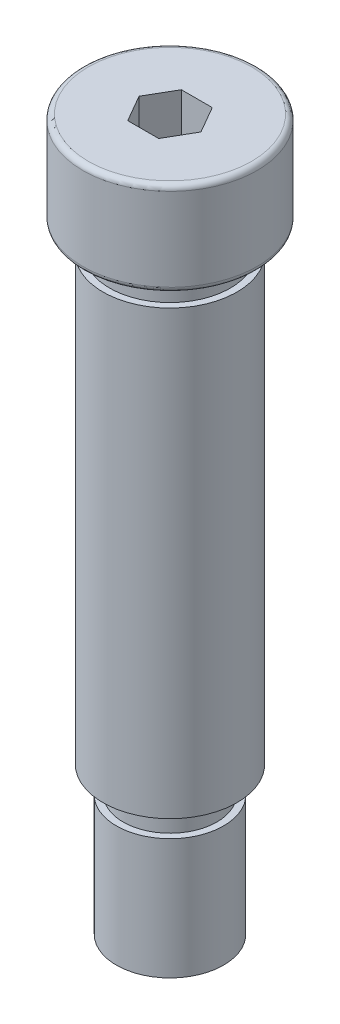
ISO-10303-21;
HEADER;
FILE_DESCRIPTION(('STEP AP214'),'2;1');
FILE_NAME('part.step','',(''),(''),'','','');
FILE_SCHEMA(('AUTOMOTIVE_DESIGN { 1 0 10303 214 1 1 1 1 }'));
ENDSEC;
DATA;
#1=APPLICATION_CONTEXT('core data for automotive mechanical design processes');
#2=APPLICATION_PROTOCOL_DEFINITION('international standard','automotive_design',2000,#1);
#3=PRODUCT_CONTEXT('',#1,'mechanical');
#4=PRODUCT('Part','Part','',(#3));
#5=PRODUCT_RELATED_PRODUCT_CATEGORY('part','',(#4));
#6=PRODUCT_DEFINITION_FORMATION('','',#4);
#7=PRODUCT_DEFINITION_CONTEXT('part definition',#1,'design');
#8=PRODUCT_DEFINITION('design','',#6,#7);
#9=PRODUCT_DEFINITION_SHAPE('','',#8);
#10=(LENGTH_UNIT() NAMED_UNIT(*) SI_UNIT(.MILLI.,.METRE.));
#11=(NAMED_UNIT(*) PLANE_ANGLE_UNIT() SI_UNIT($,.RADIAN.));
#12=(NAMED_UNIT(*) SI_UNIT($,.STERADIAN.) SOLID_ANGLE_UNIT());
#13=UNCERTAINTY_MEASURE_WITH_UNIT(LENGTH_MEASURE(1.E-05),#10,'distance_accuracy_value','');
#14=(GEOMETRIC_REPRESENTATION_CONTEXT(3) GLOBAL_UNCERTAINTY_ASSIGNED_CONTEXT((#13)) GLOBAL_UNIT_ASSIGNED_CONTEXT((#10,
#11,#12)) REPRESENTATION_CONTEXT('',''));
#15=CARTESIAN_POINT('',(0.,0.,0.));
#16=DIRECTION('',(0.,0.,1.));
#17=DIRECTION('',(1.,0.,0.));
#18=AXIS2_PLACEMENT_3D('',#15,#16,#17);
#19=CARTESIAN_POINT('',(0.,53.,0.));
#20=DIRECTION('',(0.,-1.,0.));
#21=DIRECTION('',(0.,0.,-1.));
#22=AXIS2_PLACEMENT_3D('',#19,#20,#21);
#23=PLANE('',#22);
#24=DIRECTION('',(-1.,0.,0.));
#25=VECTOR('',#24,1.);
#26=CARTESIAN_POINT('',(1.15470053837925,53.,-2.));
#27=LINE('',#26,#25);
#28=CARTESIAN_POINT('',(1.15470053837925,53.,-2.));
#29=VERTEX_POINT('',#28);
#30=CARTESIAN_POINT('',(-1.15470053837925,53.,-2.));
#31=VERTEX_POINT('',#30);
#32=EDGE_CURVE('E126',#29,#31,#27,.T.);
#33=ORIENTED_EDGE('',*,*,#32,.F.);
#34=DIRECTION('',(-0.5,0.,-0.866025403784439));
#35=VECTOR('',#34,1.);
#36=CARTESIAN_POINT('',(2.3094010767585,53.,0.));
#37=LINE('',#36,#35);
#38=CARTESIAN_POINT('',(2.3094010767585,53.,0.));
#39=VERTEX_POINT('',#38);
#40=EDGE_CURVE('E52',#39,#29,#37,.T.);
#41=ORIENTED_EDGE('',*,*,#40,.F.);
#42=DIRECTION('',(0.5,0.,-0.866025403784439));
#43=VECTOR('',#42,1.);
#44=CARTESIAN_POINT('',(1.15470053837925,53.,2.));
#45=LINE('',#44,#43);
#46=CARTESIAN_POINT('',(1.15470053837925,53.,2.));
#47=VERTEX_POINT('',#46);
#48=EDGE_CURVE('E135',#47,#39,#45,.T.);
#49=ORIENTED_EDGE('',*,*,#48,.F.);
#50=DIRECTION('',(1.,0.,0.));
#51=VECTOR('',#50,1.);
#52=CARTESIAN_POINT('',(-1.15470053837925,53.,2.));
#53=LINE('',#52,#51);
#54=CARTESIAN_POINT('',(-1.15470053837925,53.,2.));
#55=VERTEX_POINT('',#54);
#56=EDGE_CURVE('E133',#55,#47,#53,.T.);
#57=ORIENTED_EDGE('',*,*,#56,.F.);
#58=DIRECTION('',(0.5,0.,0.866025403784439));
#59=VECTOR('',#58,1.);
#60=CARTESIAN_POINT('',(-2.3094010767585,53.,0.));
#61=LINE('',#60,#59);
#62=CARTESIAN_POINT('',(-2.3094010767585,53.,0.));
#63=VERTEX_POINT('',#62);
#64=EDGE_CURVE('E100',#63,#55,#61,.T.);
#65=ORIENTED_EDGE('',*,*,#64,.F.);
#66=DIRECTION('',(-0.5,0.,0.866025403784439));
#67=VECTOR('',#66,1.);
#68=CARTESIAN_POINT('',(-1.15470053837925,53.,-2.));
#69=LINE('',#68,#67);
#70=EDGE_CURVE('E129',#31,#63,#69,.T.);
#71=ORIENTED_EDGE('',*,*,#70,.F.);
#72=EDGE_LOOP('',(#33,#41,#49,#57,#65,#71));
#73=FACE_BOUND('',#72,.T.);
#74=CARTESIAN_POINT('',(0.,53.,0.));
#75=DIRECTION('',(0.,-1.,0.));
#76=DIRECTION('',(0.,0.,-1.));
#77=AXIS2_PLACEMENT_3D('',#74,#75,#76);
#78=CIRCLE('',#77,6.1);
#79=CARTESIAN_POINT('',(0.,53.,-6.1));
#80=VERTEX_POINT('',#79);
#81=EDGE_CURVE('E11',#80,#80,#78,.T.);
#82=ORIENTED_EDGE('',*,*,#81,.F.);
#83=EDGE_LOOP('',(#82));
#84=FACE_BOUND('',#83,.T.);
#85=ADVANCED_FACE('F38',(#73,#84),#23,.F.);
#86=CARTESIAN_POINT('',(0.,52.6,0.));
#87=DIRECTION('',(0.,-1.,0.));
#88=DIRECTION('',(0.,0.,-1.));
#89=AXIS2_PLACEMENT_3D('',#86,#87,#88);
#90=TOROIDAL_SURFACE('',#89,6.1,0.399999999999996);
#91=CARTESIAN_POINT('',(0.,52.6,0.));
#92=DIRECTION('',(0.,-1.,0.));
#93=DIRECTION('',(0.,0.,-1.));
#94=AXIS2_PLACEMENT_3D('',#91,#92,#93);
#95=CIRCLE('',#94,6.5);
#96=CARTESIAN_POINT('',(0.,52.6,-6.5));
#97=VERTEX_POINT('',#96);
#98=EDGE_CURVE('E45',#97,#97,#95,.T.);
#99=ORIENTED_EDGE('',*,*,#98,.F.);
#100=EDGE_LOOP('',(#99));
#101=FACE_BOUND('',#100,.T.);
#102=ORIENTED_EDGE('',*,*,#81,.T.);
#103=EDGE_LOOP('',(#102));
#104=FACE_BOUND('',#103,.T.);
#105=ADVANCED_FACE('F178',(#101,#104),#90,.T.);
#106=CARTESIAN_POINT('',(0.,0.,0.));
#107=DIRECTION('',(0.,-1.,0.));
#108=DIRECTION('',(0.,0.,-1.));
#109=AXIS2_PLACEMENT_3D('',#106,#107,#108);
#110=CYLINDRICAL_SURFACE('',#109,6.5);
#111=CARTESIAN_POINT('',(0.,46.4,0.));
#112=DIRECTION('',(0.,-1.,0.));
#113=DIRECTION('',(0.,0.,-1.));
#114=AXIS2_PLACEMENT_3D('',#111,#112,#113);
#115=CIRCLE('',#114,6.5);
#116=CARTESIAN_POINT('',(0.,46.4,-6.5));
#117=VERTEX_POINT('',#116);
#118=EDGE_CURVE('E171',#117,#117,#115,.T.);
#119=ORIENTED_EDGE('',*,*,#118,.F.);
#120=EDGE_LOOP('',(#119));
#121=FACE_BOUND('',#120,.T.);
#122=ORIENTED_EDGE('',*,*,#98,.T.);
#123=EDGE_LOOP('',(#122));
#124=FACE_BOUND('',#123,.T.);
#125=ADVANCED_FACE('F176',(#121,#124),#110,.T.);
#126=CARTESIAN_POINT('',(0.,46.4,0.));
#127=DIRECTION('',(0.,-1.,0.));
#128=DIRECTION('',(0.,0.,-1.));
#129=AXIS2_PLACEMENT_3D('',#126,#127,#128);
#130=TOROIDAL_SURFACE('',#129,6.1,0.399999999999998);
#131=CARTESIAN_POINT('',(0.,46.,0.));
#132=DIRECTION('',(0.,-1.,0.));
#133=DIRECTION('',(0.,0.,-1.));
#134=AXIS2_PLACEMENT_3D('',#131,#132,#133);
#135=CIRCLE('',#134,6.1);
#136=CARTESIAN_POINT('',(0.,46.,-6.1));
#137=VERTEX_POINT('',#136);
#138=EDGE_CURVE('E168',#137,#137,#135,.T.);
#139=ORIENTED_EDGE('',*,*,#138,.F.);
#140=EDGE_LOOP('',(#139));
#141=FACE_BOUND('',#140,.T.);
#142=ORIENTED_EDGE('',*,*,#118,.T.);
#143=EDGE_LOOP('',(#142));
#144=FACE_BOUND('',#143,.T.);
#145=ADVANCED_FACE('F239',(#141,#144),#130,.T.);
#146=CARTESIAN_POINT('',(-6.1,46.,0.));
#147=DIRECTION('',(0.,1.,0.));
#148=DIRECTION('',(0.,0.,1.));
#149=AXIS2_PLACEMENT_3D('',#146,#147,#148);
#150=PLANE('',#149);
#151=CARTESIAN_POINT('',(0.,46.,0.));
#152=DIRECTION('',(0.,-1.,0.));
#153=DIRECTION('',(0.,0.,-1.));
#154=AXIS2_PLACEMENT_3D('',#151,#152,#153);
#155=CIRCLE('',#154,4.5);
#156=CARTESIAN_POINT('',(0.,46.,-4.5));
#157=VERTEX_POINT('',#156);
#158=EDGE_CURVE('E165',#157,#157,#155,.T.);
#159=ORIENTED_EDGE('',*,*,#158,.F.);
#160=EDGE_LOOP('',(#159));
#161=FACE_BOUND('',#160,.T.);
#162=ORIENTED_EDGE('',*,*,#138,.T.);
#163=EDGE_LOOP('',(#162));
#164=FACE_BOUND('',#163,.T.);
#165=ADVANCED_FACE('F235',(#161,#164),#150,.F.);
#166=CARTESIAN_POINT('',(0.,0.,0.));
#167=DIRECTION('',(0.,-1.,0.));
#168=DIRECTION('',(0.,0.,-1.));
#169=AXIS2_PLACEMENT_3D('',#166,#167,#168);
#170=CYLINDRICAL_SURFACE('',#169,4.5);
#171=CARTESIAN_POINT('',(0.,44.,0.));
#172=DIRECTION('',(0.,-1.,0.));
#173=DIRECTION('',(0.,0.,-1.));
#174=AXIS2_PLACEMENT_3D('',#171,#172,#173);
#175=CIRCLE('',#174,4.5);
#176=CARTESIAN_POINT('',(0.,44.,-4.5));
#177=VERTEX_POINT('',#176);
#178=EDGE_CURVE('E162',#177,#177,#175,.T.);
#179=ORIENTED_EDGE('',*,*,#178,.F.);
#180=EDGE_LOOP('',(#179));
#181=FACE_BOUND('',#180,.T.);
#182=ORIENTED_EDGE('',*,*,#158,.T.);
#183=EDGE_LOOP('',(#182));
#184=FACE_BOUND('',#183,.T.);
#185=ADVANCED_FACE('F231',(#181,#184),#170,.T.);
#186=CARTESIAN_POINT('',(-4.5,44.,0.));
#187=DIRECTION('',(0.,-1.,0.));
#188=DIRECTION('',(0.,0.,-1.));
#189=AXIS2_PLACEMENT_3D('',#186,#187,#188);
#190=PLANE('',#189);
#191=CARTESIAN_POINT('',(0.,44.,0.));
#192=DIRECTION('',(0.,-1.,0.));
#193=DIRECTION('',(0.,0.,-1.));
#194=AXIS2_PLACEMENT_3D('',#191,#192,#193);
#195=CIRCLE('',#194,5.);
#196=CARTESIAN_POINT('',(0.,44.,-5.));
#197=VERTEX_POINT('',#196);
#198=EDGE_CURVE('E159',#197,#197,#195,.T.);
#199=ORIENTED_EDGE('',*,*,#198,.F.);
#200=EDGE_LOOP('',(#199));
#201=FACE_BOUND('',#200,.T.);
#202=ORIENTED_EDGE('',*,*,#178,.T.);
#203=EDGE_LOOP('',(#202));
#204=FACE_BOUND('',#203,.T.);
#205=ADVANCED_FACE('F227',(#201,#204),#190,.F.);
#206=CARTESIAN_POINT('',(0.,0.,0.));
#207=DIRECTION('',(0.,-1.,0.));
#208=DIRECTION('',(0.,0.,-1.));
#209=AXIS2_PLACEMENT_3D('',#206,#207,#208);
#210=CYLINDRICAL_SURFACE('',#209,5.);
#211=CARTESIAN_POINT('',(0.,11.,0.));
#212=DIRECTION('',(0.,-1.,0.));
#213=DIRECTION('',(0.,0.,-1.));
#214=AXIS2_PLACEMENT_3D('',#211,#212,#213);
#215=CIRCLE('',#214,5.00000000000001);
#216=CARTESIAN_POINT('',(0.,11.,-5.00000000000001));
#217=VERTEX_POINT('',#216);
#218=EDGE_CURVE('E156',#217,#217,#215,.T.);
#219=ORIENTED_EDGE('',*,*,#218,.F.);
#220=EDGE_LOOP('',(#219));
#221=FACE_BOUND('',#220,.T.);
#222=ORIENTED_EDGE('',*,*,#198,.T.);
#223=EDGE_LOOP('',(#222));
#224=FACE_BOUND('',#223,.T.);
#225=ADVANCED_FACE('F223',(#221,#224),#210,.T.);
#226=CARTESIAN_POINT('',(-5.00000000000001,11.,0.));
#227=DIRECTION('',(0.,1.,0.));
#228=DIRECTION('',(0.,0.,1.));
#229=AXIS2_PLACEMENT_3D('',#226,#227,#228);
#230=PLANE('',#229);
#231=CARTESIAN_POINT('',(0.,11.,0.));
#232=DIRECTION('',(0.,-1.,0.));
#233=DIRECTION('',(0.,0.,-1.));
#234=AXIS2_PLACEMENT_3D('',#231,#232,#233);
#235=CIRCLE('',#234,3.5);
#236=CARTESIAN_POINT('',(0.,11.,-3.5));
#237=VERTEX_POINT('',#236);
#238=EDGE_CURVE('E153',#237,#237,#235,.T.);
#239=ORIENTED_EDGE('',*,*,#238,.F.);
#240=EDGE_LOOP('',(#239));
#241=FACE_BOUND('',#240,.T.);
#242=ORIENTED_EDGE('',*,*,#218,.T.);
#243=EDGE_LOOP('',(#242));
#244=FACE_BOUND('',#243,.T.);
#245=ADVANCED_FACE('F219',(#241,#244),#230,.F.);
#246=CARTESIAN_POINT('',(0.,0.,0.));
#247=DIRECTION('',(0.,-1.,0.));
#248=DIRECTION('',(0.,0.,-1.));
#249=AXIS2_PLACEMENT_3D('',#246,#247,#248);
#250=CYLINDRICAL_SURFACE('',#249,3.5);
#251=CARTESIAN_POINT('',(0.,9.,0.));
#252=DIRECTION('',(0.,-1.,0.));
#253=DIRECTION('',(0.,0.,-1.));
#254=AXIS2_PLACEMENT_3D('',#251,#252,#253);
#255=CIRCLE('',#254,3.5);
#256=CARTESIAN_POINT('',(0.,9.,-3.5));
#257=VERTEX_POINT('',#256);
#258=EDGE_CURVE('E150',#257,#257,#255,.T.);
#259=ORIENTED_EDGE('',*,*,#258,.F.);
#260=EDGE_LOOP('',(#259));
#261=FACE_BOUND('',#260,.T.);
#262=ORIENTED_EDGE('',*,*,#238,.T.);
#263=EDGE_LOOP('',(#262));
#264=FACE_BOUND('',#263,.T.);
#265=ADVANCED_FACE('F215',(#261,#264),#250,.T.);
#266=CARTESIAN_POINT('',(-3.5,9.,0.));
#267=DIRECTION('',(0.,-1.,0.));
#268=DIRECTION('',(0.,0.,-1.));
#269=AXIS2_PLACEMENT_3D('',#266,#267,#268);
#270=PLANE('',#269);
#271=CARTESIAN_POINT('',(0.,9.,0.));
#272=DIRECTION('',(0.,-1.,0.));
#273=DIRECTION('',(0.,0.,-1.));
#274=AXIS2_PLACEMENT_3D('',#271,#272,#273);
#275=CIRCLE('',#274,4.);
#276=CARTESIAN_POINT('',(0.,9.,-4.));
#277=VERTEX_POINT('',#276);
#278=EDGE_CURVE('E147',#277,#277,#275,.T.);
#279=ORIENTED_EDGE('',*,*,#278,.F.);
#280=EDGE_LOOP('',(#279));
#281=FACE_BOUND('',#280,.T.);
#282=ORIENTED_EDGE('',*,*,#258,.T.);
#283=EDGE_LOOP('',(#282));
#284=FACE_BOUND('',#283,.T.);
#285=ADVANCED_FACE('F211',(#281,#284),#270,.F.);
#286=CARTESIAN_POINT('',(0.,0.,0.));
#287=DIRECTION('',(0.,-1.,0.));
#288=DIRECTION('',(0.,0.,-1.));
#289=AXIS2_PLACEMENT_3D('',#286,#287,#288);
#290=CYLINDRICAL_SURFACE('',#289,4.);
#291=CARTESIAN_POINT('',(0.,0.,0.));
#292=DIRECTION('',(0.,-1.,0.));
#293=DIRECTION('',(0.,0.,-1.));
#294=AXIS2_PLACEMENT_3D('',#291,#292,#293);
#295=CIRCLE('',#294,4.);
#296=CARTESIAN_POINT('',(0.,0.,-4.));
#297=VERTEX_POINT('',#296);
#298=EDGE_CURVE('E139',#297,#297,#295,.T.);
#299=ORIENTED_EDGE('',*,*,#298,.F.);
#300=EDGE_LOOP('',(#299));
#301=FACE_BOUND('',#300,.T.);
#302=ORIENTED_EDGE('',*,*,#278,.T.);
#303=EDGE_LOOP('',(#302));
#304=FACE_BOUND('',#303,.T.);
#305=ADVANCED_FACE('F203',(#301,#304),#290,.T.);
#306=CARTESIAN_POINT('',(-4.,0.,0.));
#307=DIRECTION('',(0.,1.,0.));
#308=DIRECTION('',(0.,0.,1.));
#309=AXIS2_PLACEMENT_3D('',#306,#307,#308);
#310=PLANE('',#309);
#311=ORIENTED_EDGE('',*,*,#298,.T.);
#312=EDGE_LOOP('',(#311));
#313=FACE_BOUND('',#312,.T.);
#314=ADVANCED_FACE('F196',(#313),#310,.F.);
#315=CARTESIAN_POINT('',(2.3094010767585,49.5,0.));
#316=DIRECTION('',(0.866025403784439,0.,-0.5));
#317=DIRECTION('',(-0.5,0.,-0.866025403784439));
#318=AXIS2_PLACEMENT_3D('',#315,#316,#317);
#319=PLANE('',#318);
#320=ORIENTED_EDGE('',*,*,#40,.T.);
#321=DIRECTION('',(0.,1.,0.));
#322=VECTOR('',#321,1.);
#323=CARTESIAN_POINT('',(1.15470053837925,49.5,-2.));
#324=LINE('',#323,#322);
#325=CARTESIAN_POINT('',(1.15470053837925,49.5,-2.));
#326=VERTEX_POINT('',#325);
#327=EDGE_CURVE('E82',#326,#29,#324,.T.);
#328=ORIENTED_EDGE('',*,*,#327,.F.);
#329=DIRECTION('',(-0.5,0.,-0.866025403784439));
#330=VECTOR('',#329,1.);
#331=CARTESIAN_POINT('',(2.3094010767585,49.5,0.));
#332=LINE('',#331,#330);
#333=CARTESIAN_POINT('',(2.3094010767585,49.5,0.));
#334=VERTEX_POINT('',#333);
#335=EDGE_CURVE('E137',#334,#326,#332,.T.);
#336=ORIENTED_EDGE('',*,*,#335,.F.);
#337=DIRECTION('',(0.,1.,0.));
#338=VECTOR('',#337,1.);
#339=CARTESIAN_POINT('',(2.3094010767585,49.5,0.));
#340=LINE('',#339,#338);
#341=EDGE_CURVE('E60',#334,#39,#340,.T.);
#342=ORIENTED_EDGE('',*,*,#341,.T.);
#343=EDGE_LOOP('',(#320,#328,#336,#342));
#344=FACE_BOUND('',#343,.T.);
#345=ADVANCED_FACE('F193',(#344),#319,.F.);
#346=CARTESIAN_POINT('',(1.15470053837925,49.5,2.));
#347=DIRECTION('',(0.866025403784439,0.,0.5));
#348=DIRECTION('',(0.5,0.,-0.866025403784439));
#349=AXIS2_PLACEMENT_3D('',#346,#347,#348);
#350=PLANE('',#349);
#351=ORIENTED_EDGE('',*,*,#48,.T.);
#352=ORIENTED_EDGE('',*,*,#341,.F.);
#353=DIRECTION('',(0.5,0.,-0.866025403784439));
#354=VECTOR('',#353,1.);
#355=CARTESIAN_POINT('',(1.15470053837925,49.5,2.));
#356=LINE('',#355,#354);
#357=CARTESIAN_POINT('',(1.15470053837925,49.5,2.));
#358=VERTEX_POINT('',#357);
#359=EDGE_CURVE('E112',#358,#334,#356,.T.);
#360=ORIENTED_EDGE('',*,*,#359,.F.);
#361=DIRECTION('',(0.,1.,0.));
#362=VECTOR('',#361,1.);
#363=CARTESIAN_POINT('',(1.15470053837925,49.5,2.));
#364=LINE('',#363,#362);
#365=EDGE_CURVE('E104',#358,#47,#364,.T.);
#366=ORIENTED_EDGE('',*,*,#365,.T.);
#367=EDGE_LOOP('',(#351,#352,#360,#366));
#368=FACE_BOUND('',#367,.T.);
#369=ADVANCED_FACE('F195',(#368),#350,.F.);
#370=CARTESIAN_POINT('',(-1.15470053837925,49.5,2.));
#371=DIRECTION('',(0.,0.,1.));
#372=DIRECTION('',(1.,0.,0.));
#373=AXIS2_PLACEMENT_3D('',#370,#371,#372);
#374=PLANE('',#373);
#375=ORIENTED_EDGE('',*,*,#56,.T.);
#376=ORIENTED_EDGE('',*,*,#365,.F.);
#377=DIRECTION('',(1.,0.,0.));
#378=VECTOR('',#377,1.);
#379=CARTESIAN_POINT('',(-1.15470053837925,49.5,2.));
#380=LINE('',#379,#378);
#381=CARTESIAN_POINT('',(-1.15470053837925,49.5,2.));
#382=VERTEX_POINT('',#381);
#383=EDGE_CURVE('E108',#382,#358,#380,.T.);
#384=ORIENTED_EDGE('',*,*,#383,.F.);
#385=DIRECTION('',(0.,1.,0.));
#386=VECTOR('',#385,1.);
#387=CARTESIAN_POINT('',(-1.15470053837925,49.5,2.));
#388=LINE('',#387,#386);
#389=EDGE_CURVE('E93',#382,#55,#388,.T.);
#390=ORIENTED_EDGE('',*,*,#389,.T.);
#391=EDGE_LOOP('',(#375,#376,#384,#390));
#392=FACE_BOUND('',#391,.T.);
#393=ADVANCED_FACE('F109',(#392),#374,.F.);
#394=CARTESIAN_POINT('',(-2.3094010767585,49.5,0.));
#395=DIRECTION('',(-0.866025403784439,0.,0.5));
#396=DIRECTION('',(0.5,0.,0.866025403784439));
#397=AXIS2_PLACEMENT_3D('',#394,#395,#396);
#398=PLANE('',#397);
#399=ORIENTED_EDGE('',*,*,#64,.T.);
#400=ORIENTED_EDGE('',*,*,#389,.F.);
#401=DIRECTION('',(0.5,0.,0.866025403784439));
#402=VECTOR('',#401,1.);
#403=CARTESIAN_POINT('',(-2.3094010767585,49.5,0.));
#404=LINE('',#403,#402);
#405=CARTESIAN_POINT('',(-2.3094010767585,49.5,0.));
#406=VERTEX_POINT('',#405);
#407=EDGE_CURVE('E97',#406,#382,#404,.T.);
#408=ORIENTED_EDGE('',*,*,#407,.F.);
#409=DIRECTION('',(0.,1.,0.));
#410=VECTOR('',#409,1.);
#411=CARTESIAN_POINT('',(-2.3094010767585,49.5,0.));
#412=LINE('',#411,#410);
#413=EDGE_CURVE('E105',#406,#63,#412,.T.);
#414=ORIENTED_EDGE('',*,*,#413,.T.);
#415=EDGE_LOOP('',(#399,#400,#408,#414));
#416=FACE_BOUND('',#415,.T.);
#417=ADVANCED_FACE('F95',(#416),#398,.F.);
#418=CARTESIAN_POINT('',(-1.15470053837925,49.5,-2.));
#419=DIRECTION('',(-0.866025403784439,0.,-0.5));
#420=DIRECTION('',(-0.5,0.,0.866025403784439));
#421=AXIS2_PLACEMENT_3D('',#418,#419,#420);
#422=PLANE('',#421);
#423=ORIENTED_EDGE('',*,*,#70,.T.);
#424=ORIENTED_EDGE('',*,*,#413,.F.);
#425=DIRECTION('',(-0.5,0.,0.866025403784439));
#426=VECTOR('',#425,1.);
#427=CARTESIAN_POINT('',(-1.15470053837925,49.5,-2.));
#428=LINE('',#427,#426);
#429=CARTESIAN_POINT('',(-1.15470053837925,49.5,-2.));
#430=VERTEX_POINT('',#429);
#431=EDGE_CURVE('E118',#430,#406,#428,.T.);
#432=ORIENTED_EDGE('',*,*,#431,.F.);
#433=DIRECTION('',(0.,1.,0.));
#434=VECTOR('',#433,1.);
#435=CARTESIAN_POINT('',(-1.15470053837925,49.5,-2.));
#436=LINE('',#435,#434);
#437=EDGE_CURVE('E142',#430,#31,#436,.T.);
#438=ORIENTED_EDGE('',*,*,#437,.T.);
#439=EDGE_LOOP('',(#423,#424,#432,#438));
#440=FACE_BOUND('',#439,.T.);
#441=ADVANCED_FACE('F326',(#440),#422,.F.);
#442=CARTESIAN_POINT('',(1.15470053837925,49.5,-2.));
#443=DIRECTION('',(0.,0.,-1.));
#444=DIRECTION('',(-1.,0.,0.));
#445=AXIS2_PLACEMENT_3D('',#442,#443,#444);
#446=PLANE('',#445);
#447=ORIENTED_EDGE('',*,*,#32,.T.);
#448=ORIENTED_EDGE('',*,*,#437,.F.);
#449=DIRECTION('',(-1.,0.,0.));
#450=VECTOR('',#449,1.);
#451=CARTESIAN_POINT('',(1.15470053837925,49.5,-2.));
#452=LINE('',#451,#450);
#453=EDGE_CURVE('E120',#326,#430,#452,.T.);
#454=ORIENTED_EDGE('',*,*,#453,.F.);
#455=ORIENTED_EDGE('',*,*,#327,.T.);
#456=EDGE_LOOP('',(#447,#448,#454,#455));
#457=FACE_BOUND('',#456,.T.);
#458=ADVANCED_FACE('F191',(#457),#446,.F.);
#459=CARTESIAN_POINT('',(0.,49.5,0.));
#460=DIRECTION('',(0.,1.,0.));
#461=DIRECTION('',(0.,0.,1.));
#462=AXIS2_PLACEMENT_3D('',#459,#460,#461);
#463=PLANE('',#462);
#464=ORIENTED_EDGE('',*,*,#335,.T.);
#465=ORIENTED_EDGE('',*,*,#453,.T.);
#466=ORIENTED_EDGE('',*,*,#431,.T.);
#467=ORIENTED_EDGE('',*,*,#407,.T.);
#468=ORIENTED_EDGE('',*,*,#383,.T.);
#469=ORIENTED_EDGE('',*,*,#359,.T.);
#470=EDGE_LOOP('',(#464,#465,#466,#467,#468,#469));
#471=FACE_BOUND('',#470,.T.);
#472=ADVANCED_FACE('F115',(#471),#463,.T.);
#473=CLOSED_SHELL('',(#85,#105,#125,#145,#165,#185,#205,#225,#245,#265,#285,#305,#314,#345,#369,
#393,#417,#441,#458,#472));
#474=MANIFOLD_SOLID_BREP('B2',#473);
#475=ADVANCED_BREP_SHAPE_REPRESENTATION('',(#18,#474),#14);
#476=SHAPE_DEFINITION_REPRESENTATION(#9,#475);
ENDSEC;
END-ISO-10303-21;
